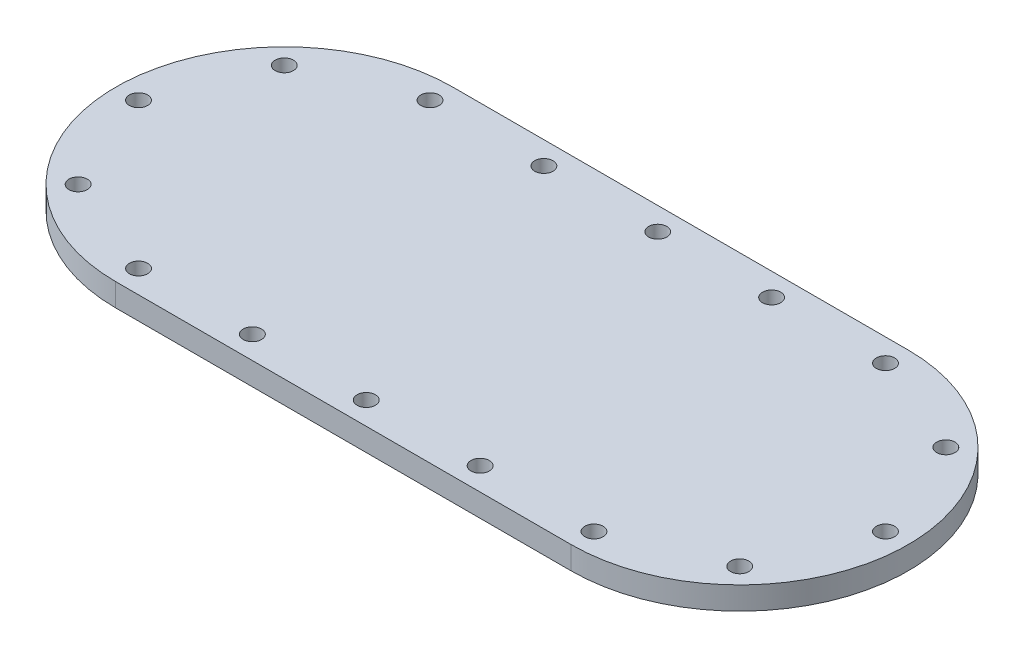
ISO-10303-21;
HEADER;
FILE_DESCRIPTION(('STEP AP214'),'2;1');
FILE_NAME('part.step','',(''),(''),'','','');
FILE_SCHEMA(('AUTOMOTIVE_DESIGN { 1 0 10303 214 1 1 1 1 }'));
ENDSEC;
DATA;
#1=APPLICATION_CONTEXT('core data for automotive mechanical design processes');
#2=APPLICATION_PROTOCOL_DEFINITION('international standard','automotive_design',2000,#1);
#3=PRODUCT_CONTEXT('',#1,'mechanical');
#4=PRODUCT('Part','Part','',(#3));
#5=PRODUCT_RELATED_PRODUCT_CATEGORY('part','',(#4));
#6=PRODUCT_DEFINITION_FORMATION('','',#4);
#7=PRODUCT_DEFINITION_CONTEXT('part definition',#1,'design');
#8=PRODUCT_DEFINITION('design','',#6,#7);
#9=PRODUCT_DEFINITION_SHAPE('','',#8);
#10=(LENGTH_UNIT() NAMED_UNIT(*) SI_UNIT(.MILLI.,.METRE.));
#11=(NAMED_UNIT(*) PLANE_ANGLE_UNIT() SI_UNIT($,.RADIAN.));
#12=(NAMED_UNIT(*) SI_UNIT($,.STERADIAN.) SOLID_ANGLE_UNIT());
#13=UNCERTAINTY_MEASURE_WITH_UNIT(LENGTH_MEASURE(1.E-05),#10,'distance_accuracy_value','');
#14=(GEOMETRIC_REPRESENTATION_CONTEXT(3) GLOBAL_UNCERTAINTY_ASSIGNED_CONTEXT((#13)) GLOBAL_UNIT_ASSIGNED_CONTEXT((#10,
#11,#12)) REPRESENTATION_CONTEXT('',''));
#15=CARTESIAN_POINT('',(0.,0.,0.));
#16=DIRECTION('',(0.,0.,1.));
#17=DIRECTION('',(1.,0.,0.));
#18=AXIS2_PLACEMENT_3D('',#15,#16,#17);
#19=CARTESIAN_POINT('',(0.,6.35,-46.99));
#20=DIRECTION('',(0.,0.,-1.));
#21=DIRECTION('',(-1.,0.,0.));
#22=AXIS2_PLACEMENT_3D('',#19,#20,#21);
#23=PLANE('',#22);
#24=DIRECTION('',(1.,0.,0.));
#25=VECTOR('',#24,1.);
#26=CARTESIAN_POINT('',(0.,0.,-46.99));
#27=LINE('',#26,#25);
#28=CARTESIAN_POINT('',(-63.5,0.,-46.99));
#29=VERTEX_POINT('',#28);
#30=CARTESIAN_POINT('',(63.5,0.,-46.99));
#31=VERTEX_POINT('',#30);
#32=EDGE_CURVE('E111',#29,#31,#27,.T.);
#33=ORIENTED_EDGE('',*,*,#32,.F.);
#34=DIRECTION('',(0.,-1.,0.));
#35=VECTOR('',#34,1.);
#36=CARTESIAN_POINT('',(-63.5,6.35,-46.99));
#37=LINE('',#36,#35);
#38=CARTESIAN_POINT('',(-63.5,6.35,-46.99));
#39=VERTEX_POINT('',#38);
#40=EDGE_CURVE('E11',#39,#29,#37,.T.);
#41=ORIENTED_EDGE('',*,*,#40,.F.);
#42=DIRECTION('',(1.,0.,0.));
#43=VECTOR('',#42,1.);
#44=CARTESIAN_POINT('',(0.,6.35,-46.99));
#45=LINE('',#44,#43);
#46=CARTESIAN_POINT('',(63.5,6.35,-46.99));
#47=VERTEX_POINT('',#46);
#48=EDGE_CURVE('E97',#39,#47,#45,.T.);
#49=ORIENTED_EDGE('',*,*,#48,.T.);
#50=DIRECTION('',(0.,-1.,0.));
#51=VECTOR('',#50,1.);
#52=CARTESIAN_POINT('',(63.5,6.35,-46.99));
#53=LINE('',#52,#51);
#54=EDGE_CURVE('E79',#47,#31,#53,.T.);
#55=ORIENTED_EDGE('',*,*,#54,.T.);
#56=EDGE_LOOP('',(#33,#41,#49,#55));
#57=FACE_BOUND('',#56,.T.);
#58=ADVANCED_FACE('F40',(#57),#23,.T.);
#59=CARTESIAN_POINT('',(-63.5,6.35,0.));
#60=DIRECTION('',(0.,-1.,0.));
#61=DIRECTION('',(0.,0.,-1.));
#62=AXIS2_PLACEMENT_3D('',#59,#60,#61);
#63=CYLINDRICAL_SURFACE('',#62,46.99);
#64=CARTESIAN_POINT('',(-63.5,0.,0.));
#65=DIRECTION('',(0.,1.,0.));
#66=DIRECTION('',(0.,0.,1.));
#67=AXIS2_PLACEMENT_3D('',#64,#65,#66);
#68=CIRCLE('',#67,46.99);
#69=CARTESIAN_POINT('',(-63.5,0.,46.99));
#70=VERTEX_POINT('',#69);
#71=EDGE_CURVE('E102',#29,#70,#68,.T.);
#72=ORIENTED_EDGE('',*,*,#71,.T.);
#73=DIRECTION('',(0.,-1.,0.));
#74=VECTOR('',#73,1.);
#75=CARTESIAN_POINT('',(-63.5,6.35,46.99));
#76=LINE('',#75,#74);
#77=CARTESIAN_POINT('',(-63.5,6.35,46.99));
#78=VERTEX_POINT('',#77);
#79=EDGE_CURVE('E49',#78,#70,#76,.T.);
#80=ORIENTED_EDGE('',*,*,#79,.F.);
#81=CARTESIAN_POINT('',(-63.5,6.35,0.));
#82=DIRECTION('',(0.,1.,0.));
#83=DIRECTION('',(0.,0.,1.));
#84=AXIS2_PLACEMENT_3D('',#81,#82,#83);
#85=CIRCLE('',#84,46.99);
#86=EDGE_CURVE('E94',#39,#78,#85,.T.);
#87=ORIENTED_EDGE('',*,*,#86,.F.);
#88=ORIENTED_EDGE('',*,*,#40,.T.);
#89=EDGE_LOOP('',(#72,#80,#87,#88));
#90=FACE_BOUND('',#89,.T.);
#91=ADVANCED_FACE('F100',(#90),#63,.T.);
#92=CARTESIAN_POINT('',(0.,6.35,46.99));
#93=DIRECTION('',(0.,0.,-1.));
#94=DIRECTION('',(-1.,0.,0.));
#95=AXIS2_PLACEMENT_3D('',#92,#93,#94);
#96=PLANE('',#95);
#97=DIRECTION('',(1.,0.,0.));
#98=VECTOR('',#97,1.);
#99=CARTESIAN_POINT('',(0.,0.,46.99));
#100=LINE('',#99,#98);
#101=CARTESIAN_POINT('',(63.5,0.,46.99));
#102=VERTEX_POINT('',#101);
#103=EDGE_CURVE('E108',#70,#102,#100,.T.);
#104=ORIENTED_EDGE('',*,*,#103,.T.);
#105=DIRECTION('',(0.,-1.,0.));
#106=VECTOR('',#105,1.);
#107=CARTESIAN_POINT('',(63.5,6.35,46.99));
#108=LINE('',#107,#106);
#109=CARTESIAN_POINT('',(63.5,6.35,46.99));
#110=VERTEX_POINT('',#109);
#111=EDGE_CURVE('E93',#110,#102,#108,.T.);
#112=ORIENTED_EDGE('',*,*,#111,.F.);
#113=DIRECTION('',(1.,0.,0.));
#114=VECTOR('',#113,1.);
#115=CARTESIAN_POINT('',(0.,6.35,46.99));
#116=LINE('',#115,#114);
#117=EDGE_CURVE('E87',#78,#110,#116,.T.);
#118=ORIENTED_EDGE('',*,*,#117,.F.);
#119=ORIENTED_EDGE('',*,*,#79,.T.);
#120=EDGE_LOOP('',(#104,#112,#118,#119));
#121=FACE_BOUND('',#120,.T.);
#122=ADVANCED_FACE('F90',(#121),#96,.F.);
#123=CARTESIAN_POINT('',(-63.5,6.35,-40.64));
#124=DIRECTION('',(0.,-1.,0.));
#125=DIRECTION('',(0.,0.,-1.));
#126=AXIS2_PLACEMENT_3D('',#123,#124,#125);
#127=CYLINDRICAL_SURFACE('',#126,2.5527);
#128=CARTESIAN_POINT('',(-63.5,6.35,-40.64));
#129=DIRECTION('',(0.,1.,0.));
#130=DIRECTION('',(0.,0.,1.));
#131=AXIS2_PLACEMENT_3D('',#128,#129,#130);
#132=CIRCLE('',#131,2.5527);
#133=CARTESIAN_POINT('',(-63.5,6.35,-38.0873));
#134=VERTEX_POINT('',#133);
#135=EDGE_CURVE('E163',#134,#134,#132,.T.);
#136=ORIENTED_EDGE('',*,*,#135,.T.);
#137=EDGE_LOOP('',(#136));
#138=FACE_BOUND('',#137,.T.);
#139=CARTESIAN_POINT('',(-63.5,0.,-40.64));
#140=DIRECTION('',(0.,1.,0.));
#141=DIRECTION('',(0.,0.,1.));
#142=AXIS2_PLACEMENT_3D('',#139,#140,#141);
#143=CIRCLE('',#142,2.5527);
#144=CARTESIAN_POINT('',(-63.5,0.,-38.0873));
#145=VERTEX_POINT('',#144);
#146=EDGE_CURVE('E113',#145,#145,#143,.T.);
#147=ORIENTED_EDGE('',*,*,#146,.F.);
#148=EDGE_LOOP('',(#147));
#149=FACE_BOUND('',#148,.T.);
#150=ADVANCED_FACE('F248',(#138,#149),#127,.F.);
#151=CARTESIAN_POINT('',(-31.7499999999999,6.35,-40.64));
#152=DIRECTION('',(0.,-1.,0.));
#153=DIRECTION('',(0.,0.,-1.));
#154=AXIS2_PLACEMENT_3D('',#151,#152,#153);
#155=CYLINDRICAL_SURFACE('',#154,2.5527);
#156=CARTESIAN_POINT('',(-31.7499999999999,6.35,-40.64));
#157=DIRECTION('',(0.,1.,0.));
#158=DIRECTION('',(0.,0.,1.));
#159=AXIS2_PLACEMENT_3D('',#156,#157,#158);
#160=CIRCLE('',#159,2.5527);
#161=CARTESIAN_POINT('',(-31.7499999999999,6.35,-38.0873));
#162=VERTEX_POINT('',#161);
#163=EDGE_CURVE('E166',#162,#162,#160,.T.);
#164=ORIENTED_EDGE('',*,*,#163,.T.);
#165=EDGE_LOOP('',(#164));
#166=FACE_BOUND('',#165,.T.);
#167=CARTESIAN_POINT('',(-31.7499999999999,0.,-40.64));
#168=DIRECTION('',(0.,1.,0.));
#169=DIRECTION('',(0.,0.,1.));
#170=AXIS2_PLACEMENT_3D('',#167,#168,#169);
#171=CIRCLE('',#170,2.5527);
#172=CARTESIAN_POINT('',(-31.7499999999999,0.,-38.0873));
#173=VERTEX_POINT('',#172);
#174=EDGE_CURVE('E116',#173,#173,#171,.T.);
#175=ORIENTED_EDGE('',*,*,#174,.F.);
#176=EDGE_LOOP('',(#175));
#177=FACE_BOUND('',#176,.T.);
#178=ADVANCED_FACE('F251',(#166,#177),#155,.F.);
#179=CARTESIAN_POINT('',(0.,6.35,-40.64));
#180=DIRECTION('',(0.,-1.,0.));
#181=DIRECTION('',(0.,0.,-1.));
#182=AXIS2_PLACEMENT_3D('',#179,#180,#181);
#183=CYLINDRICAL_SURFACE('',#182,2.5527);
#184=CARTESIAN_POINT('',(0.,6.35,-40.64));
#185=DIRECTION('',(0.,1.,0.));
#186=DIRECTION('',(0.,0.,1.));
#187=AXIS2_PLACEMENT_3D('',#184,#185,#186);
#188=CIRCLE('',#187,2.5527);
#189=CARTESIAN_POINT('',(0.,6.35,-38.0873));
#190=VERTEX_POINT('',#189);
#191=EDGE_CURVE('E169',#190,#190,#188,.T.);
#192=ORIENTED_EDGE('',*,*,#191,.T.);
#193=EDGE_LOOP('',(#192));
#194=FACE_BOUND('',#193,.T.);
#195=CARTESIAN_POINT('',(0.,0.,-40.64));
#196=DIRECTION('',(0.,1.,0.));
#197=DIRECTION('',(0.,0.,1.));
#198=AXIS2_PLACEMENT_3D('',#195,#196,#197);
#199=CIRCLE('',#198,2.5527);
#200=CARTESIAN_POINT('',(0.,0.,-38.0873));
#201=VERTEX_POINT('',#200);
#202=EDGE_CURVE('E119',#201,#201,#199,.T.);
#203=ORIENTED_EDGE('',*,*,#202,.F.);
#204=EDGE_LOOP('',(#203));
#205=FACE_BOUND('',#204,.T.);
#206=ADVANCED_FACE('F268',(#194,#205),#183,.F.);
#207=CARTESIAN_POINT('',(31.7500000000001,6.35,-40.64));
#208=DIRECTION('',(0.,-1.,0.));
#209=DIRECTION('',(0.,0.,-1.));
#210=AXIS2_PLACEMENT_3D('',#207,#208,#209);
#211=CYLINDRICAL_SURFACE('',#210,2.5527);
#212=CARTESIAN_POINT('',(31.7500000000001,6.35,-40.64));
#213=DIRECTION('',(0.,1.,0.));
#214=DIRECTION('',(0.,0.,1.));
#215=AXIS2_PLACEMENT_3D('',#212,#213,#214);
#216=CIRCLE('',#215,2.5527);
#217=CARTESIAN_POINT('',(31.7500000000001,6.35,-38.0873));
#218=VERTEX_POINT('',#217);
#219=EDGE_CURVE('E172',#218,#218,#216,.T.);
#220=ORIENTED_EDGE('',*,*,#219,.T.);
#221=EDGE_LOOP('',(#220));
#222=FACE_BOUND('',#221,.T.);
#223=CARTESIAN_POINT('',(31.7500000000001,0.,-40.64));
#224=DIRECTION('',(0.,1.,0.));
#225=DIRECTION('',(0.,0.,1.));
#226=AXIS2_PLACEMENT_3D('',#223,#224,#225);
#227=CIRCLE('',#226,2.5527);
#228=CARTESIAN_POINT('',(31.7500000000001,0.,-38.0873));
#229=VERTEX_POINT('',#228);
#230=EDGE_CURVE('E122',#229,#229,#227,.T.);
#231=ORIENTED_EDGE('',*,*,#230,.F.);
#232=EDGE_LOOP('',(#231));
#233=FACE_BOUND('',#232,.T.);
#234=ADVANCED_FACE('F272',(#222,#233),#211,.F.);
#235=CARTESIAN_POINT('',(63.5000000000001,6.35,-40.64));
#236=DIRECTION('',(0.,-1.,0.));
#237=DIRECTION('',(0.,0.,-1.));
#238=AXIS2_PLACEMENT_3D('',#235,#236,#237);
#239=CYLINDRICAL_SURFACE('',#238,2.5527);
#240=CARTESIAN_POINT('',(63.5000000000001,6.35,-40.64));
#241=DIRECTION('',(0.,1.,0.));
#242=DIRECTION('',(0.,0.,1.));
#243=AXIS2_PLACEMENT_3D('',#240,#241,#242);
#244=CIRCLE('',#243,2.5527);
#245=CARTESIAN_POINT('',(63.5000000000001,6.35,-38.0873));
#246=VERTEX_POINT('',#245);
#247=EDGE_CURVE('E175',#246,#246,#244,.T.);
#248=ORIENTED_EDGE('',*,*,#247,.T.);
#249=EDGE_LOOP('',(#248));
#250=FACE_BOUND('',#249,.T.);
#251=CARTESIAN_POINT('',(63.5000000000001,0.,-40.64));
#252=DIRECTION('',(0.,1.,0.));
#253=DIRECTION('',(0.,0.,1.));
#254=AXIS2_PLACEMENT_3D('',#251,#252,#253);
#255=CIRCLE('',#254,2.5527);
#256=CARTESIAN_POINT('',(63.5000000000001,0.,-38.0873));
#257=VERTEX_POINT('',#256);
#258=EDGE_CURVE('E125',#257,#257,#255,.T.);
#259=ORIENTED_EDGE('',*,*,#258,.F.);
#260=EDGE_LOOP('',(#259));
#261=FACE_BOUND('',#260,.T.);
#262=ADVANCED_FACE('F276',(#250,#261),#239,.F.);
#263=CARTESIAN_POINT('',(92.2368195874217,6.35,-28.7368195874219));
#264=DIRECTION('',(0.,-1.,0.));
#265=DIRECTION('',(0.,0.,-1.));
#266=AXIS2_PLACEMENT_3D('',#263,#264,#265);
#267=CYLINDRICAL_SURFACE('',#266,2.5527);
#268=CARTESIAN_POINT('',(92.2368195874217,6.35,-28.7368195874219));
#269=DIRECTION('',(0.,1.,0.));
#270=DIRECTION('',(0.,0.,1.));
#271=AXIS2_PLACEMENT_3D('',#268,#269,#270);
#272=CIRCLE('',#271,2.5527);
#273=CARTESIAN_POINT('',(92.2368195874217,6.35,-26.1841195874219));
#274=VERTEX_POINT('',#273);
#275=EDGE_CURVE('E178',#274,#274,#272,.T.);
#276=ORIENTED_EDGE('',*,*,#275,.T.);
#277=EDGE_LOOP('',(#276));
#278=FACE_BOUND('',#277,.T.);
#279=CARTESIAN_POINT('',(92.2368195874217,0.,-28.7368195874219));
#280=DIRECTION('',(0.,1.,0.));
#281=DIRECTION('',(0.,0.,1.));
#282=AXIS2_PLACEMENT_3D('',#279,#280,#281);
#283=CIRCLE('',#282,2.5527);
#284=CARTESIAN_POINT('',(92.2368195874217,0.,-26.1841195874219));
#285=VERTEX_POINT('',#284);
#286=EDGE_CURVE('E128',#285,#285,#283,.T.);
#287=ORIENTED_EDGE('',*,*,#286,.F.);
#288=EDGE_LOOP('',(#287));
#289=FACE_BOUND('',#288,.T.);
#290=ADVANCED_FACE('F280',(#278,#289),#267,.F.);
#291=CARTESIAN_POINT('',(104.140000000001,6.35,-9.15933995315754E-13));
#292=DIRECTION('',(0.,-1.,0.));
#293=DIRECTION('',(0.,0.,-1.));
#294=AXIS2_PLACEMENT_3D('',#291,#292,#293);
#295=CYLINDRICAL_SURFACE('',#294,2.5527);
#296=CARTESIAN_POINT('',(104.140000000001,6.35,-9.15933995315754E-13));
#297=DIRECTION('',(0.,1.,0.));
#298=DIRECTION('',(0.,0.,1.));
#299=AXIS2_PLACEMENT_3D('',#296,#297,#298);
#300=CIRCLE('',#299,2.5527);
#301=CARTESIAN_POINT('',(104.140000000001,6.35,2.55269999999908));
#302=VERTEX_POINT('',#301);
#303=EDGE_CURVE('E181',#302,#302,#300,.T.);
#304=ORIENTED_EDGE('',*,*,#303,.T.);
#305=EDGE_LOOP('',(#304));
#306=FACE_BOUND('',#305,.T.);
#307=CARTESIAN_POINT('',(104.140000000001,0.,-9.15933995315754E-13));
#308=DIRECTION('',(0.,1.,0.));
#309=DIRECTION('',(0.,0.,1.));
#310=AXIS2_PLACEMENT_3D('',#307,#308,#309);
#311=CIRCLE('',#310,2.5527);
#312=CARTESIAN_POINT('',(104.140000000001,0.,2.55269999999908));
#313=VERTEX_POINT('',#312);
#314=EDGE_CURVE('E131',#313,#313,#311,.T.);
#315=ORIENTED_EDGE('',*,*,#314,.F.);
#316=EDGE_LOOP('',(#315));
#317=FACE_BOUND('',#316,.T.);
#318=ADVANCED_FACE('F284',(#306,#317),#295,.F.);
#319=CARTESIAN_POINT('',(92.236819587423,6.35,28.7368195874207));
#320=DIRECTION('',(0.,-1.,0.));
#321=DIRECTION('',(0.,0.,-1.));
#322=AXIS2_PLACEMENT_3D('',#319,#320,#321);
#323=CYLINDRICAL_SURFACE('',#322,2.5527);
#324=CARTESIAN_POINT('',(92.236819587423,6.35,28.7368195874207));
#325=DIRECTION('',(0.,1.,0.));
#326=DIRECTION('',(0.,0.,1.));
#327=AXIS2_PLACEMENT_3D('',#324,#325,#326);
#328=CIRCLE('',#327,2.5527);
#329=CARTESIAN_POINT('',(92.236819587423,6.35,31.2895195874207));
#330=VERTEX_POINT('',#329);
#331=EDGE_CURVE('E184',#330,#330,#328,.T.);
#332=ORIENTED_EDGE('',*,*,#331,.T.);
#333=EDGE_LOOP('',(#332));
#334=FACE_BOUND('',#333,.T.);
#335=CARTESIAN_POINT('',(92.236819587423,0.,28.7368195874207));
#336=DIRECTION('',(0.,1.,0.));
#337=DIRECTION('',(0.,0.,1.));
#338=AXIS2_PLACEMENT_3D('',#335,#336,#337);
#339=CIRCLE('',#338,2.5527);
#340=CARTESIAN_POINT('',(92.236819587423,0.,31.2895195874207));
#341=VERTEX_POINT('',#340);
#342=EDGE_CURVE('E134',#341,#341,#339,.T.);
#343=ORIENTED_EDGE('',*,*,#342,.F.);
#344=EDGE_LOOP('',(#343));
#345=FACE_BOUND('',#344,.T.);
#346=ADVANCED_FACE('F288',(#334,#345),#323,.F.);
#347=CARTESIAN_POINT('',(63.500000000002,6.35,40.64));
#348=DIRECTION('',(0.,-1.,0.));
#349=DIRECTION('',(0.,0.,-1.));
#350=AXIS2_PLACEMENT_3D('',#347,#348,#349);
#351=CYLINDRICAL_SURFACE('',#350,2.5527);
#352=CARTESIAN_POINT('',(63.500000000002,6.35,40.64));
#353=DIRECTION('',(0.,1.,0.));
#354=DIRECTION('',(0.,0.,1.));
#355=AXIS2_PLACEMENT_3D('',#352,#353,#354);
#356=CIRCLE('',#355,2.5527);
#357=CARTESIAN_POINT('',(63.500000000002,6.35,43.1927));
#358=VERTEX_POINT('',#357);
#359=EDGE_CURVE('E187',#358,#358,#356,.T.);
#360=ORIENTED_EDGE('',*,*,#359,.T.);
#361=EDGE_LOOP('',(#360));
#362=FACE_BOUND('',#361,.T.);
#363=CARTESIAN_POINT('',(63.500000000002,0.,40.64));
#364=DIRECTION('',(0.,1.,0.));
#365=DIRECTION('',(0.,0.,1.));
#366=AXIS2_PLACEMENT_3D('',#363,#364,#365);
#367=CIRCLE('',#366,2.5527);
#368=CARTESIAN_POINT('',(63.500000000002,0.,43.1927));
#369=VERTEX_POINT('',#368);
#370=EDGE_CURVE('E137',#369,#369,#367,.T.);
#371=ORIENTED_EDGE('',*,*,#370,.F.);
#372=EDGE_LOOP('',(#371));
#373=FACE_BOUND('',#372,.T.);
#374=ADVANCED_FACE('F292',(#362,#373),#351,.F.);
#375=CARTESIAN_POINT('',(-92.2368195874208,6.35,-28.7368195874203));
#376=DIRECTION('',(0.,-1.,0.));
#377=DIRECTION('',(0.,0.,-1.));
#378=AXIS2_PLACEMENT_3D('',#375,#376,#377);
#379=CYLINDRICAL_SURFACE('',#378,2.55270000000001);
#380=CARTESIAN_POINT('',(-92.2368195874208,6.35,-28.7368195874203));
#381=DIRECTION('',(0.,1.,0.));
#382=DIRECTION('',(0.,0.,1.));
#383=AXIS2_PLACEMENT_3D('',#380,#381,#382);
#384=CIRCLE('',#383,2.55270000000001);
#385=CARTESIAN_POINT('',(-92.2368195874208,6.35,-26.1841195874203));
#386=VERTEX_POINT('',#385);
#387=EDGE_CURVE('E190',#386,#386,#384,.T.);
#388=ORIENTED_EDGE('',*,*,#387,.T.);
#389=EDGE_LOOP('',(#388));
#390=FACE_BOUND('',#389,.T.);
#391=CARTESIAN_POINT('',(-92.2368195874208,0.,-28.7368195874203));
#392=DIRECTION('',(0.,1.,0.));
#393=DIRECTION('',(0.,0.,1.));
#394=AXIS2_PLACEMENT_3D('',#391,#392,#393);
#395=CIRCLE('',#394,2.55270000000001);
#396=CARTESIAN_POINT('',(-92.2368195874208,0.,-26.1841195874203));
#397=VERTEX_POINT('',#396);
#398=EDGE_CURVE('E140',#397,#397,#395,.T.);
#399=ORIENTED_EDGE('',*,*,#398,.F.);
#400=EDGE_LOOP('',(#399));
#401=FACE_BOUND('',#400,.T.);
#402=ADVANCED_FACE('F296',(#390,#401),#379,.F.);
#403=CARTESIAN_POINT('',(-104.139999999999,6.35,1.38777878078145E-12));
#404=DIRECTION('',(0.,-1.,0.));
#405=DIRECTION('',(0.,0.,-1.));
#406=AXIS2_PLACEMENT_3D('',#403,#404,#405);
#407=CYLINDRICAL_SURFACE('',#406,2.55270000000001);
#408=CARTESIAN_POINT('',(-104.139999999999,6.35,1.38777878078145E-12));
#409=DIRECTION('',(0.,1.,0.));
#410=DIRECTION('',(0.,0.,1.));
#411=AXIS2_PLACEMENT_3D('',#408,#409,#410);
#412=CIRCLE('',#411,2.55270000000001);
#413=CARTESIAN_POINT('',(-104.139999999999,6.35,2.5527000000014));
#414=VERTEX_POINT('',#413);
#415=EDGE_CURVE('E193',#414,#414,#412,.T.);
#416=ORIENTED_EDGE('',*,*,#415,.T.);
#417=EDGE_LOOP('',(#416));
#418=FACE_BOUND('',#417,.T.);
#419=CARTESIAN_POINT('',(-104.139999999999,0.,1.38777878078145E-12));
#420=DIRECTION('',(0.,1.,0.));
#421=DIRECTION('',(0.,0.,1.));
#422=AXIS2_PLACEMENT_3D('',#419,#420,#421);
#423=CIRCLE('',#422,2.55270000000001);
#424=CARTESIAN_POINT('',(-104.139999999999,0.,2.5527000000014));
#425=VERTEX_POINT('',#424);
#426=EDGE_CURVE('E143',#425,#425,#423,.T.);
#427=ORIENTED_EDGE('',*,*,#426,.F.);
#428=EDGE_LOOP('',(#427));
#429=FACE_BOUND('',#428,.T.);
#430=ADVANCED_FACE('F300',(#418,#429),#407,.F.);
#431=CARTESIAN_POINT('',(-92.2368195874189,6.35,28.7368195874223));
#432=DIRECTION('',(0.,-1.,0.));
#433=DIRECTION('',(0.,0.,-1.));
#434=AXIS2_PLACEMENT_3D('',#431,#432,#433);
#435=CYLINDRICAL_SURFACE('',#434,2.5527);
#436=CARTESIAN_POINT('',(-92.2368195874189,6.35,28.7368195874223));
#437=DIRECTION('',(0.,1.,0.));
#438=DIRECTION('',(0.,0.,1.));
#439=AXIS2_PLACEMENT_3D('',#436,#437,#438);
#440=CIRCLE('',#439,2.5527);
#441=CARTESIAN_POINT('',(-92.2368195874189,6.35,31.2895195874223));
#442=VERTEX_POINT('',#441);
#443=EDGE_CURVE('E196',#442,#442,#440,.T.);
#444=ORIENTED_EDGE('',*,*,#443,.T.);
#445=EDGE_LOOP('',(#444));
#446=FACE_BOUND('',#445,.T.);
#447=CARTESIAN_POINT('',(-92.2368195874189,0.,28.7368195874223));
#448=DIRECTION('',(0.,1.,0.));
#449=DIRECTION('',(0.,0.,1.));
#450=AXIS2_PLACEMENT_3D('',#447,#448,#449);
#451=CIRCLE('',#450,2.5527);
#452=CARTESIAN_POINT('',(-92.2368195874189,0.,31.2895195874223));
#453=VERTEX_POINT('',#452);
#454=EDGE_CURVE('E146',#453,#453,#451,.T.);
#455=ORIENTED_EDGE('',*,*,#454,.F.);
#456=EDGE_LOOP('',(#455));
#457=FACE_BOUND('',#456,.T.);
#458=ADVANCED_FACE('F304',(#446,#457),#435,.F.);
#459=CARTESIAN_POINT('',(-63.4999999999972,6.35,40.64));
#460=DIRECTION('',(0.,-1.,0.));
#461=DIRECTION('',(0.,0.,-1.));
#462=AXIS2_PLACEMENT_3D('',#459,#460,#461);
#463=CYLINDRICAL_SURFACE('',#462,2.5527);
#464=CARTESIAN_POINT('',(-63.4999999999972,6.35,40.64));
#465=DIRECTION('',(0.,1.,0.));
#466=DIRECTION('',(0.,0.,1.));
#467=AXIS2_PLACEMENT_3D('',#464,#465,#466);
#468=CIRCLE('',#467,2.5527);
#469=CARTESIAN_POINT('',(-63.4999999999972,6.35,43.1927));
#470=VERTEX_POINT('',#469);
#471=EDGE_CURVE('E199',#470,#470,#468,.T.);
#472=ORIENTED_EDGE('',*,*,#471,.T.);
#473=EDGE_LOOP('',(#472));
#474=FACE_BOUND('',#473,.T.);
#475=CARTESIAN_POINT('',(-63.4999999999972,0.,40.64));
#476=DIRECTION('',(0.,1.,0.));
#477=DIRECTION('',(0.,0.,1.));
#478=AXIS2_PLACEMENT_3D('',#475,#476,#477);
#479=CIRCLE('',#478,2.5527);
#480=CARTESIAN_POINT('',(-63.4999999999972,0.,43.1927));
#481=VERTEX_POINT('',#480);
#482=EDGE_CURVE('E149',#481,#481,#479,.T.);
#483=ORIENTED_EDGE('',*,*,#482,.F.);
#484=EDGE_LOOP('',(#483));
#485=FACE_BOUND('',#484,.T.);
#486=ADVANCED_FACE('F308',(#474,#485),#463,.F.);
#487=CARTESIAN_POINT('',(31.750000000002,6.35,40.6400000000002));
#488=DIRECTION('',(0.,-1.,0.));
#489=DIRECTION('',(0.,0.,-1.));
#490=AXIS2_PLACEMENT_3D('',#487,#488,#489);
#491=CYLINDRICAL_SURFACE('',#490,2.5527);
#492=CARTESIAN_POINT('',(31.750000000002,6.35,40.6400000000002));
#493=DIRECTION('',(0.,1.,0.));
#494=DIRECTION('',(0.,0.,1.));
#495=AXIS2_PLACEMENT_3D('',#492,#493,#494);
#496=CIRCLE('',#495,2.5527);
#497=CARTESIAN_POINT('',(31.750000000002,6.35,43.1927000000003));
#498=VERTEX_POINT('',#497);
#499=EDGE_CURVE('E202',#498,#498,#496,.T.);
#500=ORIENTED_EDGE('',*,*,#499,.T.);
#501=EDGE_LOOP('',(#500));
#502=FACE_BOUND('',#501,.T.);
#503=CARTESIAN_POINT('',(31.750000000002,0.,40.6400000000002));
#504=DIRECTION('',(0.,1.,0.));
#505=DIRECTION('',(0.,0.,1.));
#506=AXIS2_PLACEMENT_3D('',#503,#504,#505);
#507=CIRCLE('',#506,2.5527);
#508=CARTESIAN_POINT('',(31.750000000002,0.,43.1927000000003));
#509=VERTEX_POINT('',#508);
#510=EDGE_CURVE('E152',#509,#509,#507,.T.);
#511=ORIENTED_EDGE('',*,*,#510,.F.);
#512=EDGE_LOOP('',(#511));
#513=FACE_BOUND('',#512,.T.);
#514=ADVANCED_FACE('F312',(#502,#513),#491,.F.);
#515=CARTESIAN_POINT('',(1.95676808090184E-12,6.35,40.6400000000005));
#516=DIRECTION('',(0.,-1.,0.));
#517=DIRECTION('',(0.,0.,-1.));
#518=AXIS2_PLACEMENT_3D('',#515,#516,#517);
#519=CYLINDRICAL_SURFACE('',#518,2.5527);
#520=CARTESIAN_POINT('',(1.95676808090184E-12,6.35,40.6400000000005));
#521=DIRECTION('',(0.,1.,0.));
#522=DIRECTION('',(0.,0.,1.));
#523=AXIS2_PLACEMENT_3D('',#520,#521,#522);
#524=CIRCLE('',#523,2.5527);
#525=CARTESIAN_POINT('',(1.95676808090184E-12,6.35,43.1927000000005));
#526=VERTEX_POINT('',#525);
#527=EDGE_CURVE('E205',#526,#526,#524,.T.);
#528=ORIENTED_EDGE('',*,*,#527,.T.);
#529=EDGE_LOOP('',(#528));
#530=FACE_BOUND('',#529,.T.);
#531=CARTESIAN_POINT('',(1.95676808090184E-12,0.,40.6400000000005));
#532=DIRECTION('',(0.,1.,0.));
#533=DIRECTION('',(0.,0.,1.));
#534=AXIS2_PLACEMENT_3D('',#531,#532,#533);
#535=CIRCLE('',#534,2.5527);
#536=CARTESIAN_POINT('',(1.95676808090184E-12,0.,43.1927000000005));
#537=VERTEX_POINT('',#536);
#538=EDGE_CURVE('E155',#537,#537,#535,.T.);
#539=ORIENTED_EDGE('',*,*,#538,.F.);
#540=EDGE_LOOP('',(#539));
#541=FACE_BOUND('',#540,.T.);
#542=ADVANCED_FACE('F315',(#530,#541),#519,.F.);
#543=CARTESIAN_POINT('',(-31.749999999998,6.35,40.6400000000007));
#544=DIRECTION('',(0.,-1.,0.));
#545=DIRECTION('',(0.,0.,-1.));
#546=AXIS2_PLACEMENT_3D('',#543,#544,#545);
#547=CYLINDRICAL_SURFACE('',#546,2.55269999999999);
#548=CARTESIAN_POINT('',(-31.749999999998,6.35,40.6400000000007));
#549=DIRECTION('',(0.,1.,0.));
#550=DIRECTION('',(0.,0.,1.));
#551=AXIS2_PLACEMENT_3D('',#548,#549,#550);
#552=CIRCLE('',#551,2.55269999999999);
#553=CARTESIAN_POINT('',(-31.749999999998,6.35,43.1927000000007));
#554=VERTEX_POINT('',#553);
#555=EDGE_CURVE('E107',#554,#554,#552,.T.);
#556=ORIENTED_EDGE('',*,*,#555,.T.);
#557=EDGE_LOOP('',(#556));
#558=FACE_BOUND('',#557,.T.);
#559=CARTESIAN_POINT('',(-31.749999999998,0.,40.6400000000007));
#560=DIRECTION('',(0.,1.,0.));
#561=DIRECTION('',(0.,0.,1.));
#562=AXIS2_PLACEMENT_3D('',#559,#560,#561);
#563=CIRCLE('',#562,2.55269999999999);
#564=CARTESIAN_POINT('',(-31.749999999998,0.,43.1927000000007));
#565=VERTEX_POINT('',#564);
#566=EDGE_CURVE('E158',#565,#565,#563,.T.);
#567=ORIENTED_EDGE('',*,*,#566,.F.);
#568=EDGE_LOOP('',(#567));
#569=FACE_BOUND('',#568,.T.);
#570=ADVANCED_FACE('F42',(#558,#569),#547,.F.);
#571=CARTESIAN_POINT('',(63.5,6.35,0.));
#572=DIRECTION('',(0.,-1.,0.));
#573=DIRECTION('',(0.,0.,-1.));
#574=AXIS2_PLACEMENT_3D('',#571,#572,#573);
#575=CYLINDRICAL_SURFACE('',#574,46.99);
#576=CARTESIAN_POINT('',(63.5,0.,0.));
#577=DIRECTION('',(0.,1.,0.));
#578=DIRECTION('',(0.,0.,1.));
#579=AXIS2_PLACEMENT_3D('',#576,#577,#578);
#580=CIRCLE('',#579,46.99);
#581=EDGE_CURVE('E72',#102,#31,#580,.T.);
#582=ORIENTED_EDGE('',*,*,#581,.T.);
#583=ORIENTED_EDGE('',*,*,#54,.F.);
#584=CARTESIAN_POINT('',(63.5,6.35,0.));
#585=DIRECTION('',(0.,1.,0.));
#586=DIRECTION('',(0.,0.,1.));
#587=AXIS2_PLACEMENT_3D('',#584,#585,#586);
#588=CIRCLE('',#587,46.99);
#589=EDGE_CURVE('E57',#110,#47,#588,.T.);
#590=ORIENTED_EDGE('',*,*,#589,.F.);
#591=ORIENTED_EDGE('',*,*,#111,.T.);
#592=EDGE_LOOP('',(#582,#583,#590,#591));
#593=FACE_BOUND('',#592,.T.);
#594=ADVANCED_FACE('F216',(#593),#575,.T.);
#595=CARTESIAN_POINT('',(0.,6.35,0.));
#596=DIRECTION('',(0.,1.,0.));
#597=DIRECTION('',(0.,0.,1.));
#598=AXIS2_PLACEMENT_3D('',#595,#596,#597);
#599=PLANE('',#598);
#600=ORIENTED_EDGE('',*,*,#555,.F.);
#601=EDGE_LOOP('',(#600));
#602=FACE_BOUND('',#601,.T.);
#603=ORIENTED_EDGE('',*,*,#527,.F.);
#604=EDGE_LOOP('',(#603));
#605=FACE_BOUND('',#604,.T.);
#606=ORIENTED_EDGE('',*,*,#499,.F.);
#607=EDGE_LOOP('',(#606));
#608=FACE_BOUND('',#607,.T.);
#609=ORIENTED_EDGE('',*,*,#471,.F.);
#610=EDGE_LOOP('',(#609));
#611=FACE_BOUND('',#610,.T.);
#612=ORIENTED_EDGE('',*,*,#443,.F.);
#613=EDGE_LOOP('',(#612));
#614=FACE_BOUND('',#613,.T.);
#615=ORIENTED_EDGE('',*,*,#415,.F.);
#616=EDGE_LOOP('',(#615));
#617=FACE_BOUND('',#616,.T.);
#618=ORIENTED_EDGE('',*,*,#387,.F.);
#619=EDGE_LOOP('',(#618));
#620=FACE_BOUND('',#619,.T.);
#621=ORIENTED_EDGE('',*,*,#359,.F.);
#622=EDGE_LOOP('',(#621));
#623=FACE_BOUND('',#622,.T.);
#624=ORIENTED_EDGE('',*,*,#331,.F.);
#625=EDGE_LOOP('',(#624));
#626=FACE_BOUND('',#625,.T.);
#627=ORIENTED_EDGE('',*,*,#303,.F.);
#628=EDGE_LOOP('',(#627));
#629=FACE_BOUND('',#628,.T.);
#630=ORIENTED_EDGE('',*,*,#275,.F.);
#631=EDGE_LOOP('',(#630));
#632=FACE_BOUND('',#631,.T.);
#633=ORIENTED_EDGE('',*,*,#247,.F.);
#634=EDGE_LOOP('',(#633));
#635=FACE_BOUND('',#634,.T.);
#636=ORIENTED_EDGE('',*,*,#219,.F.);
#637=EDGE_LOOP('',(#636));
#638=FACE_BOUND('',#637,.T.);
#639=ORIENTED_EDGE('',*,*,#191,.F.);
#640=EDGE_LOOP('',(#639));
#641=FACE_BOUND('',#640,.T.);
#642=ORIENTED_EDGE('',*,*,#163,.F.);
#643=EDGE_LOOP('',(#642));
#644=FACE_BOUND('',#643,.T.);
#645=ORIENTED_EDGE('',*,*,#135,.F.);
#646=EDGE_LOOP('',(#645));
#647=FACE_BOUND('',#646,.T.);
#648=ORIENTED_EDGE('',*,*,#48,.F.);
#649=ORIENTED_EDGE('',*,*,#86,.T.);
#650=ORIENTED_EDGE('',*,*,#117,.T.);
#651=ORIENTED_EDGE('',*,*,#589,.T.);
#652=EDGE_LOOP('',(#648,#649,#650,#651));
#653=FACE_BOUND('',#652,.T.);
#654=ADVANCED_FACE('F96',(#602,#605,#608,#611,#614,#617,#620,#623,#626,#629,#632,#635,#638,#641,
#644,#647,#653),#599,.T.);
#655=CARTESIAN_POINT('',(0.,0.,0.));
#656=DIRECTION('',(0.,1.,0.));
#657=DIRECTION('',(0.,0.,1.));
#658=AXIS2_PLACEMENT_3D('',#655,#656,#657);
#659=PLANE('',#658);
#660=ORIENTED_EDGE('',*,*,#566,.T.);
#661=EDGE_LOOP('',(#660));
#662=FACE_BOUND('',#661,.T.);
#663=ORIENTED_EDGE('',*,*,#538,.T.);
#664=EDGE_LOOP('',(#663));
#665=FACE_BOUND('',#664,.T.);
#666=ORIENTED_EDGE('',*,*,#510,.T.);
#667=EDGE_LOOP('',(#666));
#668=FACE_BOUND('',#667,.T.);
#669=ORIENTED_EDGE('',*,*,#482,.T.);
#670=EDGE_LOOP('',(#669));
#671=FACE_BOUND('',#670,.T.);
#672=ORIENTED_EDGE('',*,*,#454,.T.);
#673=EDGE_LOOP('',(#672));
#674=FACE_BOUND('',#673,.T.);
#675=ORIENTED_EDGE('',*,*,#426,.T.);
#676=EDGE_LOOP('',(#675));
#677=FACE_BOUND('',#676,.T.);
#678=ORIENTED_EDGE('',*,*,#398,.T.);
#679=EDGE_LOOP('',(#678));
#680=FACE_BOUND('',#679,.T.);
#681=ORIENTED_EDGE('',*,*,#370,.T.);
#682=EDGE_LOOP('',(#681));
#683=FACE_BOUND('',#682,.T.);
#684=ORIENTED_EDGE('',*,*,#342,.T.);
#685=EDGE_LOOP('',(#684));
#686=FACE_BOUND('',#685,.T.);
#687=ORIENTED_EDGE('',*,*,#314,.T.);
#688=EDGE_LOOP('',(#687));
#689=FACE_BOUND('',#688,.T.);
#690=ORIENTED_EDGE('',*,*,#286,.T.);
#691=EDGE_LOOP('',(#690));
#692=FACE_BOUND('',#691,.T.);
#693=ORIENTED_EDGE('',*,*,#258,.T.);
#694=EDGE_LOOP('',(#693));
#695=FACE_BOUND('',#694,.T.);
#696=ORIENTED_EDGE('',*,*,#230,.T.);
#697=EDGE_LOOP('',(#696));
#698=FACE_BOUND('',#697,.T.);
#699=ORIENTED_EDGE('',*,*,#202,.T.);
#700=EDGE_LOOP('',(#699));
#701=FACE_BOUND('',#700,.T.);
#702=ORIENTED_EDGE('',*,*,#174,.T.);
#703=EDGE_LOOP('',(#702));
#704=FACE_BOUND('',#703,.T.);
#705=ORIENTED_EDGE('',*,*,#146,.T.);
#706=EDGE_LOOP('',(#705));
#707=FACE_BOUND('',#706,.T.);
#708=ORIENTED_EDGE('',*,*,#32,.T.);
#709=ORIENTED_EDGE('',*,*,#581,.F.);
#710=ORIENTED_EDGE('',*,*,#103,.F.);
#711=ORIENTED_EDGE('',*,*,#71,.F.);
#712=EDGE_LOOP('',(#708,#709,#710,#711));
#713=FACE_BOUND('',#712,.T.);
#714=ADVANCED_FACE('F215',(#662,#665,#668,#671,#674,#677,#680,#683,#686,#689,#692,#695,#698,
#701,#704,#707,#713),#659,.F.);
#715=CLOSED_SHELL('',(#58,#91,#122,#150,#178,#206,#234,#262,#290,#318,#346,#374,#402,#430,#458,
#486,#514,#542,#570,#594,#654,#714));
#716=MANIFOLD_SOLID_BREP('B2',#715);
#717=ADVANCED_BREP_SHAPE_REPRESENTATION('',(#18,#716),#14);
#718=SHAPE_DEFINITION_REPRESENTATION(#9,#717);
ENDSEC;
END-ISO-10303-21;
